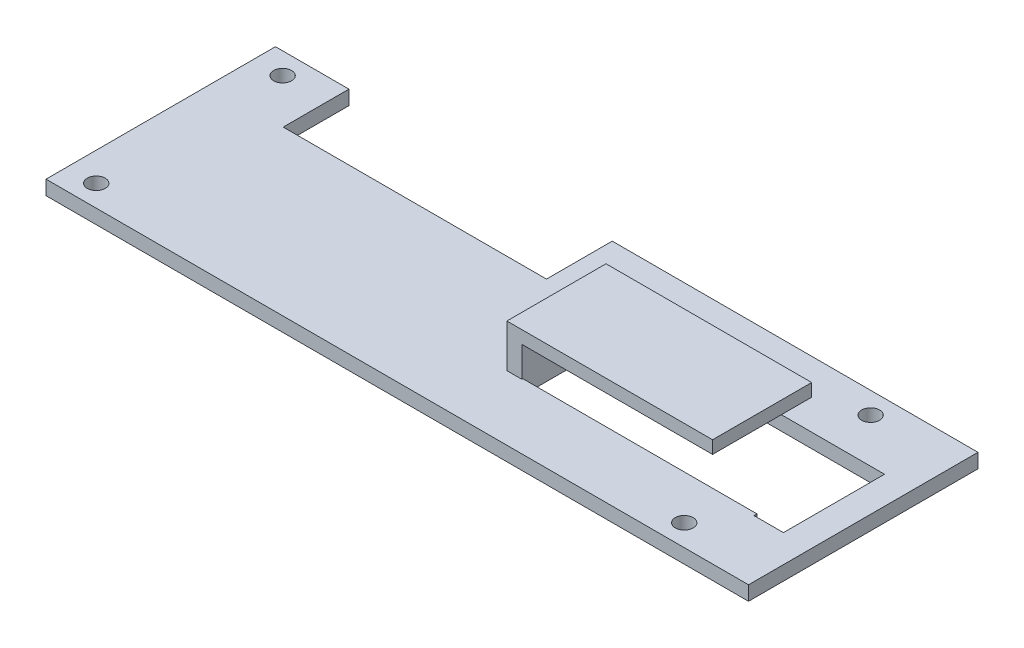
ISO-10303-21;
HEADER;
FILE_DESCRIPTION(('STEP AP214'),'2;1');
FILE_NAME('part.step','',(''),(''),'','','');
FILE_SCHEMA(('AUTOMOTIVE_DESIGN { 1 0 10303 214 1 1 1 1 }'));
ENDSEC;
DATA;
#1=APPLICATION_CONTEXT('core data for automotive mechanical design processes');
#2=APPLICATION_PROTOCOL_DEFINITION('international standard','automotive_design',2000,#1);
#3=PRODUCT_CONTEXT('',#1,'mechanical');
#4=PRODUCT('Part','Part','',(#3));
#5=PRODUCT_RELATED_PRODUCT_CATEGORY('part','',(#4));
#6=PRODUCT_DEFINITION_FORMATION('','',#4);
#7=PRODUCT_DEFINITION_CONTEXT('part definition',#1,'design');
#8=PRODUCT_DEFINITION('design','',#6,#7);
#9=PRODUCT_DEFINITION_SHAPE('','',#8);
#10=(LENGTH_UNIT() NAMED_UNIT(*) SI_UNIT(.MILLI.,.METRE.));
#11=(NAMED_UNIT(*) PLANE_ANGLE_UNIT() SI_UNIT($,.RADIAN.));
#12=(NAMED_UNIT(*) SI_UNIT($,.STERADIAN.) SOLID_ANGLE_UNIT());
#13=UNCERTAINTY_MEASURE_WITH_UNIT(LENGTH_MEASURE(1.E-05),#10,'distance_accuracy_value','');
#14=(GEOMETRIC_REPRESENTATION_CONTEXT(3) GLOBAL_UNCERTAINTY_ASSIGNED_CONTEXT((#13)) GLOBAL_UNIT_ASSIGNED_CONTEXT((#10,
#11,#12)) REPRESENTATION_CONTEXT('',''));
#15=CARTESIAN_POINT('',(0.,0.,0.));
#16=DIRECTION('',(0.,0.,1.));
#17=DIRECTION('',(1.,0.,0.));
#18=AXIS2_PLACEMENT_3D('',#15,#16,#17);
#19=CARTESIAN_POINT('',(15.6834448872923,0.,8.70004466167328));
#20=DIRECTION('',(-1.,0.,0.));
#21=DIRECTION('',(0.,0.,1.));
#22=AXIS2_PLACEMENT_3D('',#19,#20,#21);
#23=PLANE('',#22);
#24=DIRECTION('',(0.,0.,-1.));
#25=VECTOR('',#24,1.);
#26=CARTESIAN_POINT('',(15.6834448872923,7.90411967097881,8.87999145213382));
#27=LINE('',#26,#25);
#28=CARTESIAN_POINT('',(15.6834448872923,7.90411967097881,8.87999145213382));
#29=VERTEX_POINT('',#28);
#30=CARTESIAN_POINT('',(15.6834448872923,7.90411967097881,-8.67352585330855));
#31=VERTEX_POINT('',#30);
#32=EDGE_CURVE('E221',#29,#31,#27,.T.);
#33=ORIENTED_EDGE('',*,*,#32,.F.);
#34=DIRECTION('',(0.,-1.,0.));
#35=VECTOR('',#34,1.);
#36=CARTESIAN_POINT('',(15.6834448872923,10.16,8.87999145213382));
#37=LINE('',#36,#35);
#38=CARTESIAN_POINT('',(15.6834448872923,2.54,8.87999145213382));
#39=VERTEX_POINT('',#38);
#40=EDGE_CURVE('E68',#29,#39,#37,.T.);
#41=ORIENTED_EDGE('',*,*,#40,.T.);
#42=DIRECTION('',(0.,0.,-1.));
#43=VECTOR('',#42,1.);
#44=CARTESIAN_POINT('',(15.6834448872923,2.54,-8.67352585330855));
#45=LINE('',#44,#43);
#46=CARTESIAN_POINT('',(15.6834448872923,2.54,8.70004466167328));
#47=VERTEX_POINT('',#46);
#48=EDGE_CURVE('E245',#39,#47,#45,.T.);
#49=ORIENTED_EDGE('',*,*,#48,.T.);
#50=DIRECTION('',(0.,1.,0.));
#51=VECTOR('',#50,1.);
#52=CARTESIAN_POINT('',(15.6834448872923,0.,8.70004466167328));
#53=LINE('',#52,#51);
#54=CARTESIAN_POINT('',(15.6834448872923,0.,8.70004466167328));
#55=VERTEX_POINT('',#54);
#56=EDGE_CURVE('E278',#55,#47,#53,.T.);
#57=ORIENTED_EDGE('',*,*,#56,.F.);
#58=DIRECTION('',(0.,0.,1.));
#59=VECTOR('',#58,1.);
#60=CARTESIAN_POINT('',(15.6834448872923,0.,8.70004466167328));
#61=LINE('',#60,#59);
#62=CARTESIAN_POINT('',(15.6834448872923,0.,-8.67352585330855));
#63=VERTEX_POINT('',#62);
#64=EDGE_CURVE('E272',#63,#55,#61,.T.);
#65=ORIENTED_EDGE('',*,*,#64,.F.);
#66=DIRECTION('',(0.,1.,0.));
#67=VECTOR('',#66,1.);
#68=CARTESIAN_POINT('',(15.6834448872923,0.,-8.67352585330855));
#69=LINE('',#68,#67);
#70=CARTESIAN_POINT('',(15.6834448872923,2.54,-8.67352585330855));
#71=VERTEX_POINT('',#70);
#72=EDGE_CURVE('E187',#63,#71,#69,.T.);
#73=ORIENTED_EDGE('',*,*,#72,.T.);
#74=DIRECTION('',(0.,-1.,0.));
#75=VECTOR('',#74,1.);
#76=CARTESIAN_POINT('',(15.6834448872923,10.16,-8.67352585330855));
#77=LINE('',#76,#75);
#78=EDGE_CURVE('E269',#31,#71,#77,.T.);
#79=ORIENTED_EDGE('',*,*,#78,.F.);
#80=EDGE_LOOP('',(#33,#41,#49,#57,#65,#73,#79));
#81=FACE_BOUND('',#80,.T.);
#82=ADVANCED_FACE('F45',(#81),#23,.F.);
#83=CARTESIAN_POINT('',(0.,2.54,0.));
#84=DIRECTION('',(0.,-1.,0.));
#85=DIRECTION('',(0.,0.,-1.));
#86=AXIS2_PLACEMENT_3D('',#83,#84,#85);
#87=PLANE('',#86);
#88=DIRECTION('',(0.,0.,-1.));
#89=VECTOR('',#88,1.);
#90=CARTESIAN_POINT('',(67.2764948745745,2.54,20.32));
#91=LINE('',#90,#89);
#92=CARTESIAN_POINT('',(67.2764948745745,2.54,20.32));
#93=VERTEX_POINT('',#92);
#94=CARTESIAN_POINT('',(67.2764948745745,2.54,-20.32));
#95=VERTEX_POINT('',#94);
#96=EDGE_CURVE('E206',#93,#95,#91,.T.);
#97=ORIENTED_EDGE('',*,*,#96,.T.);
#98=DIRECTION('',(-1.,0.,0.));
#99=VECTOR('',#98,1.);
#100=CARTESIAN_POINT('',(-57.15,2.54,-20.32));
#101=LINE('',#100,#99);
#102=CARTESIAN_POINT('',(2.49577155822135,2.54,-20.32));
#103=VERTEX_POINT('',#102);
#104=EDGE_CURVE('E338',#95,#103,#101,.T.);
#105=ORIENTED_EDGE('',*,*,#104,.T.);
#106=DIRECTION('',(0.,0.,-1.));
#107=VECTOR('',#106,1.);
#108=CARTESIAN_POINT('',(2.49577155822135,2.54,-8.67352585330855));
#109=LINE('',#108,#107);
#110=CARTESIAN_POINT('',(2.49577155822135,2.54,-8.67352585330855));
#111=VERTEX_POINT('',#110);
#112=EDGE_CURVE('E292',#111,#103,#109,.T.);
#113=ORIENTED_EDGE('',*,*,#112,.F.);
#114=DIRECTION('',(1.,0.,0.));
#115=VECTOR('',#114,1.);
#116=CARTESIAN_POINT('',(-44.1328146347756,2.54,-8.67352585330855));
#117=LINE('',#116,#115);
#118=CARTESIAN_POINT('',(-44.1328146347756,2.54,-8.67352585330855));
#119=VERTEX_POINT('',#118);
#120=EDGE_CURVE('E294',#119,#111,#117,.T.);
#121=ORIENTED_EDGE('',*,*,#120,.F.);
#122=DIRECTION('',(0.,0.,1.));
#123=VECTOR('',#122,1.);
#124=CARTESIAN_POINT('',(-44.1328146347756,2.54,-8.67352585330855));
#125=LINE('',#124,#123);
#126=CARTESIAN_POINT('',(-44.1328146347756,2.54,-20.32));
#127=VERTEX_POINT('',#126);
#128=EDGE_CURVE('E282',#127,#119,#125,.T.);
#129=ORIENTED_EDGE('',*,*,#128,.F.);
#130=CARTESIAN_POINT('',(-57.15,2.54,-20.32));
#131=VERTEX_POINT('',#130);
#132=EDGE_CURVE('E336',#127,#131,#101,.T.);
#133=ORIENTED_EDGE('',*,*,#132,.T.);
#134=DIRECTION('',(0.,0.,1.));
#135=VECTOR('',#134,1.);
#136=CARTESIAN_POINT('',(-57.15,2.54,20.32));
#137=LINE('',#136,#135);
#138=CARTESIAN_POINT('',(-57.15,2.54,20.32));
#139=VERTEX_POINT('',#138);
#140=EDGE_CURVE('E341',#131,#139,#137,.T.);
#141=ORIENTED_EDGE('',*,*,#140,.T.);
#142=DIRECTION('',(1.,0.,0.));
#143=VECTOR('',#142,1.);
#144=CARTESIAN_POINT('',(-57.15,2.54,20.32));
#145=LINE('',#144,#143);
#146=EDGE_CURVE('E343',#139,#93,#145,.T.);
#147=ORIENTED_EDGE('',*,*,#146,.T.);
#148=EDGE_LOOP('',(#97,#105,#113,#121,#129,#133,#141,#147));
#149=FACE_BOUND('',#148,.T.);
#150=CARTESIAN_POINT('',(-52.07,2.54,-16.51));
#151=DIRECTION('',(0.,1.,0.));
#152=DIRECTION('',(0.,0.,1.));
#153=AXIS2_PLACEMENT_3D('',#150,#151,#152);
#154=CIRCLE('',#153,1.5875);
#155=CARTESIAN_POINT('',(-52.07,2.54,-14.9225));
#156=VERTEX_POINT('',#155);
#157=EDGE_CURVE('E314',#156,#156,#154,.T.);
#158=ORIENTED_EDGE('',*,*,#157,.F.);
#159=EDGE_LOOP('',(#158));
#160=FACE_BOUND('',#159,.T.);
#161=CARTESIAN_POINT('',(52.07,2.54,-16.51));
#162=DIRECTION('',(0.,1.,0.));
#163=DIRECTION('',(0.,0.,1.));
#164=AXIS2_PLACEMENT_3D('',#161,#162,#163);
#165=CIRCLE('',#164,1.5875);
#166=CARTESIAN_POINT('',(52.07,2.54,-14.9225));
#167=VERTEX_POINT('',#166);
#168=EDGE_CURVE('E311',#167,#167,#165,.T.);
#169=ORIENTED_EDGE('',*,*,#168,.F.);
#170=EDGE_LOOP('',(#169));
#171=FACE_BOUND('',#170,.T.);
#172=CARTESIAN_POINT('',(52.07,2.54,16.51));
#173=DIRECTION('',(0.,1.,0.));
#174=DIRECTION('',(0.,0.,1.));
#175=AXIS2_PLACEMENT_3D('',#172,#173,#174);
#176=CIRCLE('',#175,1.5875);
#177=CARTESIAN_POINT('',(52.07,2.54,18.0975));
#178=VERTEX_POINT('',#177);
#179=EDGE_CURVE('E318',#178,#178,#176,.T.);
#180=ORIENTED_EDGE('',*,*,#179,.F.);
#181=EDGE_LOOP('',(#180));
#182=FACE_BOUND('',#181,.T.);
#183=CARTESIAN_POINT('',(-52.07,2.54,16.51));
#184=DIRECTION('',(0.,1.,0.));
#185=DIRECTION('',(0.,0.,1.));
#186=AXIS2_PLACEMENT_3D('',#183,#184,#185);
#187=CIRCLE('',#186,1.5875);
#188=CARTESIAN_POINT('',(-52.07,2.54,18.0975));
#189=VERTEX_POINT('',#188);
#190=EDGE_CURVE('E324',#189,#189,#187,.T.);
#191=ORIENTED_EDGE('',*,*,#190,.F.);
#192=EDGE_LOOP('',(#191));
#193=FACE_BOUND('',#192,.T.);
#194=ORIENTED_EDGE('',*,*,#48,.F.);
#195=DIRECTION('',(1.,0.,0.));
#196=VECTOR('',#195,1.);
#197=CARTESIAN_POINT('',(15.6834448872923,2.54,8.87999145213382));
#198=LINE('',#197,#196);
#199=CARTESIAN_POINT('',(13.0396842858424,2.54,8.87999145213382));
#200=VERTEX_POINT('',#199);
#201=EDGE_CURVE('E249',#200,#39,#198,.T.);
#202=ORIENTED_EDGE('',*,*,#201,.F.);
#203=DIRECTION('',(0.,0.,1.));
#204=VECTOR('',#203,1.);
#205=CARTESIAN_POINT('',(13.0396842858424,2.54,-8.67352585330855));
#206=LINE('',#205,#204);
#207=CARTESIAN_POINT('',(13.0396842858424,2.54,-8.67352585330855));
#208=VERTEX_POINT('',#207);
#209=EDGE_CURVE('E257',#208,#200,#206,.T.);
#210=ORIENTED_EDGE('',*,*,#209,.F.);
#211=DIRECTION('',(-1.,0.,0.));
#212=VECTOR('',#211,1.);
#213=CARTESIAN_POINT('',(15.6834448872923,2.54,-8.67352585330855));
#214=LINE('',#213,#212);
#215=EDGE_CURVE('E254',#71,#208,#214,.T.);
#216=ORIENTED_EDGE('',*,*,#215,.F.);
#217=DIRECTION('',(-1.,0.,0.));
#218=VECTOR('',#217,1.);
#219=CARTESIAN_POINT('',(15.6834448872923,2.54,-8.67352585330855));
#220=LINE('',#219,#218);
#221=CARTESIAN_POINT('',(62.3660195602017,2.54,-8.67352585330855));
#222=VERTEX_POINT('',#221);
#223=EDGE_CURVE('E275',#222,#71,#220,.T.);
#224=ORIENTED_EDGE('',*,*,#223,.F.);
#225=DIRECTION('',(0.,0.,1.));
#226=VECTOR('',#225,1.);
#227=CARTESIAN_POINT('',(62.3660195602017,2.54,-8.67352585330855));
#228=LINE('',#227,#226);
#229=CARTESIAN_POINT('',(62.3660195602017,2.54,9.23065765432882));
#230=VERTEX_POINT('',#229);
#231=EDGE_CURVE('E197',#222,#230,#228,.T.);
#232=ORIENTED_EDGE('',*,*,#231,.T.);
#233=DIRECTION('',(-1.,0.,0.));
#234=VECTOR('',#233,1.);
#235=CARTESIAN_POINT('',(62.3660195602017,2.54,9.23065765432882));
#236=LINE('',#235,#234);
#237=CARTESIAN_POINT('',(57.15,2.54,9.23065765432881));
#238=VERTEX_POINT('',#237);
#239=EDGE_CURVE('E210',#230,#238,#236,.T.);
#240=ORIENTED_EDGE('',*,*,#239,.T.);
#241=DIRECTION('',(0.,0.,-1.));
#242=VECTOR('',#241,1.);
#243=CARTESIAN_POINT('',(57.15,2.54,20.32));
#244=LINE('',#243,#242);
#245=CARTESIAN_POINT('',(57.15,2.54,8.70004466167328));
#246=VERTEX_POINT('',#245);
#247=EDGE_CURVE('E60',#238,#246,#244,.T.);
#248=ORIENTED_EDGE('',*,*,#247,.T.);
#249=DIRECTION('',(1.,0.,0.));
#250=VECTOR('',#249,1.);
#251=CARTESIAN_POINT('',(15.6834448872923,2.54,8.70004466167328));
#252=LINE('',#251,#250);
#253=EDGE_CURVE('E279',#47,#246,#252,.T.);
#254=ORIENTED_EDGE('',*,*,#253,.F.);
#255=EDGE_LOOP('',(#194,#202,#210,#216,#224,#232,#240,#248,#254));
#256=FACE_BOUND('',#255,.T.);
#257=ADVANCED_FACE('F382',(#149,#160,#171,#182,#193,#256),#87,.F.);
#258=CARTESIAN_POINT('',(-57.15,2.54,-20.32));
#259=DIRECTION('',(0.,0.,1.));
#260=DIRECTION('',(1.,0.,0.));
#261=AXIS2_PLACEMENT_3D('',#258,#259,#260);
#262=PLANE('',#261);
#263=ORIENTED_EDGE('',*,*,#132,.F.);
#264=DIRECTION('',(0.,-1.,0.));
#265=VECTOR('',#264,1.);
#266=CARTESIAN_POINT('',(-44.1328146347756,2.54,-20.32));
#267=LINE('',#266,#265);
#268=CARTESIAN_POINT('',(-44.1328146347756,0.,-20.32));
#269=VERTEX_POINT('',#268);
#270=EDGE_CURVE('E305',#127,#269,#267,.T.);
#271=ORIENTED_EDGE('',*,*,#270,.T.);
#272=DIRECTION('',(-1.,0.,0.));
#273=VECTOR('',#272,1.);
#274=CARTESIAN_POINT('',(-57.15,0.,-20.32));
#275=LINE('',#274,#273);
#276=CARTESIAN_POINT('',(-57.15,0.,-20.32));
#277=VERTEX_POINT('',#276);
#278=EDGE_CURVE('E347',#269,#277,#275,.T.);
#279=ORIENTED_EDGE('',*,*,#278,.T.);
#280=DIRECTION('',(0.,-1.,0.));
#281=VECTOR('',#280,1.);
#282=CARTESIAN_POINT('',(-57.15,2.54,-20.32));
#283=LINE('',#282,#281);
#284=EDGE_CURVE('E356',#131,#277,#283,.T.);
#285=ORIENTED_EDGE('',*,*,#284,.F.);
#286=EDGE_LOOP('',(#263,#271,#279,#285));
#287=FACE_BOUND('',#286,.T.);
#288=ADVANCED_FACE('F366',(#287),#262,.F.);
#289=CARTESIAN_POINT('',(57.15,2.54,20.32));
#290=DIRECTION('',(-1.,0.,0.));
#291=DIRECTION('',(0.,0.,1.));
#292=AXIS2_PLACEMENT_3D('',#289,#290,#291);
#293=PLANE('',#292);
#294=ORIENTED_EDGE('',*,*,#247,.F.);
#295=DIRECTION('',(0.,1.,0.));
#296=VECTOR('',#295,1.);
#297=CARTESIAN_POINT('',(57.15,0.,9.23065765432881));
#298=LINE('',#297,#296);
#299=CARTESIAN_POINT('',(57.15,0.,9.23065765432881));
#300=VERTEX_POINT('',#299);
#301=EDGE_CURVE('E225',#300,#238,#298,.T.);
#302=ORIENTED_EDGE('',*,*,#301,.F.);
#303=DIRECTION('',(0.,0.,-1.));
#304=VECTOR('',#303,1.);
#305=CARTESIAN_POINT('',(57.15,0.,20.32));
#306=LINE('',#305,#304);
#307=CARTESIAN_POINT('',(57.15,0.,8.70004466167328));
#308=VERTEX_POINT('',#307);
#309=EDGE_CURVE('E332',#300,#308,#306,.T.);
#310=ORIENTED_EDGE('',*,*,#309,.T.);
#311=DIRECTION('',(0.,1.,0.));
#312=VECTOR('',#311,1.);
#313=CARTESIAN_POINT('',(57.15,2.54,8.70004466167328));
#314=LINE('',#313,#312);
#315=EDGE_CURVE('E308',#308,#246,#314,.T.);
#316=ORIENTED_EDGE('',*,*,#315,.T.);
#317=EDGE_LOOP('',(#294,#302,#310,#316));
#318=FACE_BOUND('',#317,.T.);
#319=ADVANCED_FACE('F47',(#318),#293,.F.);
#320=CARTESIAN_POINT('',(67.2764948745745,0.,-20.32));
#321=VERTEX_POINT('',#320);
#322=CARTESIAN_POINT('',(2.49577155822135,0.,-20.32));
#323=VERTEX_POINT('',#322);
#324=EDGE_CURVE('E348',#321,#323,#275,.T.);
#325=ORIENTED_EDGE('',*,*,#324,.T.);
#326=DIRECTION('',(0.,1.,0.));
#327=VECTOR('',#326,1.);
#328=CARTESIAN_POINT('',(2.49577155822135,2.54,-20.32));
#329=LINE('',#328,#327);
#330=EDGE_CURVE('E285',#323,#103,#329,.T.);
#331=ORIENTED_EDGE('',*,*,#330,.T.);
#332=ORIENTED_EDGE('',*,*,#104,.F.);
#333=DIRECTION('',(0.,1.,0.));
#334=VECTOR('',#333,1.);
#335=CARTESIAN_POINT('',(67.2764948745745,0.,-20.32));
#336=LINE('',#335,#334);
#337=EDGE_CURVE('E218',#321,#95,#336,.T.);
#338=ORIENTED_EDGE('',*,*,#337,.F.);
#339=EDGE_LOOP('',(#325,#331,#332,#338));
#340=FACE_BOUND('',#339,.T.);
#341=ADVANCED_FACE('F392',(#340),#262,.F.);
#342=CARTESIAN_POINT('',(-57.15,2.54,20.32));
#343=DIRECTION('',(1.,0.,0.));
#344=DIRECTION('',(0.,0.,-1.));
#345=AXIS2_PLACEMENT_3D('',#342,#343,#344);
#346=PLANE('',#345);
#347=DIRECTION('',(0.,0.,1.));
#348=VECTOR('',#347,1.);
#349=CARTESIAN_POINT('',(-57.15,0.,20.32));
#350=LINE('',#349,#348);
#351=CARTESIAN_POINT('',(-57.15,0.,20.32));
#352=VERTEX_POINT('',#351);
#353=EDGE_CURVE('E351',#277,#352,#350,.T.);
#354=ORIENTED_EDGE('',*,*,#353,.T.);
#355=DIRECTION('',(0.,-1.,0.));
#356=VECTOR('',#355,1.);
#357=CARTESIAN_POINT('',(-57.15,2.54,20.32));
#358=LINE('',#357,#356);
#359=EDGE_CURVE('E345',#139,#352,#358,.T.);
#360=ORIENTED_EDGE('',*,*,#359,.F.);
#361=ORIENTED_EDGE('',*,*,#140,.F.);
#362=ORIENTED_EDGE('',*,*,#284,.T.);
#363=EDGE_LOOP('',(#354,#360,#361,#362));
#364=FACE_BOUND('',#363,.T.);
#365=ADVANCED_FACE('F374',(#364),#346,.F.);
#366=CARTESIAN_POINT('',(-57.15,2.54,20.32));
#367=DIRECTION('',(0.,0.,-1.));
#368=DIRECTION('',(-1.,0.,0.));
#369=AXIS2_PLACEMENT_3D('',#366,#367,#368);
#370=PLANE('',#369);
#371=DIRECTION('',(1.,0.,0.));
#372=VECTOR('',#371,1.);
#373=CARTESIAN_POINT('',(-57.15,0.,20.32));
#374=LINE('',#373,#372);
#375=CARTESIAN_POINT('',(67.2764948745745,0.,20.32));
#376=VERTEX_POINT('',#375);
#377=EDGE_CURVE('E337',#352,#376,#374,.T.);
#378=ORIENTED_EDGE('',*,*,#377,.T.);
#379=DIRECTION('',(0.,1.,0.));
#380=VECTOR('',#379,1.);
#381=CARTESIAN_POINT('',(67.2764948745745,0.,20.32));
#382=LINE('',#381,#380);
#383=EDGE_CURVE('E222',#376,#93,#382,.T.);
#384=ORIENTED_EDGE('',*,*,#383,.T.);
#385=ORIENTED_EDGE('',*,*,#146,.F.);
#386=ORIENTED_EDGE('',*,*,#359,.T.);
#387=EDGE_LOOP('',(#378,#384,#385,#386));
#388=FACE_BOUND('',#387,.T.);
#389=ADVANCED_FACE('F378',(#388),#370,.F.);
#390=CARTESIAN_POINT('',(0.,0.,0.));
#391=DIRECTION('',(0.,-1.,0.));
#392=DIRECTION('',(0.,0.,-1.));
#393=AXIS2_PLACEMENT_3D('',#390,#391,#392);
#394=PLANE('',#393);
#395=ORIENTED_EDGE('',*,*,#309,.F.);
#396=DIRECTION('',(-1.,0.,0.));
#397=VECTOR('',#396,1.);
#398=CARTESIAN_POINT('',(62.3660195602017,0.,9.23065765432882));
#399=LINE('',#398,#397);
#400=CARTESIAN_POINT('',(62.3660195602017,0.,9.23065765432882));
#401=VERTEX_POINT('',#400);
#402=EDGE_CURVE('E205',#401,#300,#399,.T.);
#403=ORIENTED_EDGE('',*,*,#402,.F.);
#404=DIRECTION('',(0.,0.,1.));
#405=VECTOR('',#404,1.);
#406=CARTESIAN_POINT('',(62.3660195602017,0.,-8.67352585330855));
#407=LINE('',#406,#405);
#408=CARTESIAN_POINT('',(62.3660195602017,0.,-8.67352585330855));
#409=VERTEX_POINT('',#408);
#410=EDGE_CURVE('E195',#409,#401,#407,.T.);
#411=ORIENTED_EDGE('',*,*,#410,.F.);
#412=DIRECTION('',(1.,0.,0.));
#413=VECTOR('',#412,1.);
#414=CARTESIAN_POINT('',(0.,0.,-8.67352585330855));
#415=LINE('',#414,#413);
#416=EDGE_CURVE('E11',#63,#409,#415,.T.);
#417=ORIENTED_EDGE('',*,*,#416,.F.);
#418=ORIENTED_EDGE('',*,*,#64,.T.);
#419=DIRECTION('',(1.,0.,0.));
#420=VECTOR('',#419,1.);
#421=CARTESIAN_POINT('',(15.6834448872923,0.,8.70004466167328));
#422=LINE('',#421,#420);
#423=EDGE_CURVE('E274',#55,#308,#422,.T.);
#424=ORIENTED_EDGE('',*,*,#423,.T.);
#425=EDGE_LOOP('',(#395,#403,#411,#417,#418,#424));
#426=FACE_BOUND('',#425,.T.);
#427=DIRECTION('',(0.,0.,-1.));
#428=VECTOR('',#427,1.);
#429=CARTESIAN_POINT('',(67.2764948745745,0.,20.32));
#430=LINE('',#429,#428);
#431=EDGE_CURVE('E199',#376,#321,#430,.T.);
#432=ORIENTED_EDGE('',*,*,#431,.F.);
#433=ORIENTED_EDGE('',*,*,#377,.F.);
#434=ORIENTED_EDGE('',*,*,#353,.F.);
#435=ORIENTED_EDGE('',*,*,#278,.F.);
#436=DIRECTION('',(0.,0.,-1.));
#437=VECTOR('',#436,1.);
#438=CARTESIAN_POINT('',(-44.1328146347756,0.,0.));
#439=LINE('',#438,#437);
#440=CARTESIAN_POINT('',(-44.1328146347756,0.,-8.67352585330855));
#441=VERTEX_POINT('',#440);
#442=EDGE_CURVE('E53',#441,#269,#439,.T.);
#443=ORIENTED_EDGE('',*,*,#442,.F.);
#444=DIRECTION('',(1.,0.,0.));
#445=VECTOR('',#444,1.);
#446=CARTESIAN_POINT('',(-44.1328146347756,0.,-8.67352585330855));
#447=LINE('',#446,#445);
#448=CARTESIAN_POINT('',(2.49577155822135,0.,-8.67352585330855));
#449=VERTEX_POINT('',#448);
#450=EDGE_CURVE('E295',#441,#449,#447,.T.);
#451=ORIENTED_EDGE('',*,*,#450,.T.);
#452=DIRECTION('',(0.,0.,-1.));
#453=VECTOR('',#452,1.);
#454=CARTESIAN_POINT('',(2.49577155822135,0.,-8.67352585330855));
#455=LINE('',#454,#453);
#456=EDGE_CURVE('E290',#449,#323,#455,.T.);
#457=ORIENTED_EDGE('',*,*,#456,.T.);
#458=ORIENTED_EDGE('',*,*,#324,.F.);
#459=EDGE_LOOP('',(#432,#433,#434,#435,#443,#451,#457,#458));
#460=FACE_BOUND('',#459,.T.);
#461=CARTESIAN_POINT('',(-52.07,0.,16.51));
#462=DIRECTION('',(0.,1.,0.));
#463=DIRECTION('',(0.,0.,1.));
#464=AXIS2_PLACEMENT_3D('',#461,#462,#463);
#465=CIRCLE('',#464,1.5875);
#466=CARTESIAN_POINT('',(-52.07,0.,18.0975));
#467=VERTEX_POINT('',#466);
#468=EDGE_CURVE('E310',#467,#467,#465,.T.);
#469=ORIENTED_EDGE('',*,*,#468,.T.);
#470=EDGE_LOOP('',(#469));
#471=FACE_BOUND('',#470,.T.);
#472=CARTESIAN_POINT('',(52.07,0.,16.51));
#473=DIRECTION('',(0.,1.,0.));
#474=DIRECTION('',(0.,0.,1.));
#475=AXIS2_PLACEMENT_3D('',#472,#473,#474);
#476=CIRCLE('',#475,1.5875);
#477=CARTESIAN_POINT('',(52.07,0.,18.0975));
#478=VERTEX_POINT('',#477);
#479=EDGE_CURVE('E321',#478,#478,#476,.T.);
#480=ORIENTED_EDGE('',*,*,#479,.T.);
#481=EDGE_LOOP('',(#480));
#482=FACE_BOUND('',#481,.T.);
#483=CARTESIAN_POINT('',(52.07,0.,-16.51));
#484=DIRECTION('',(0.,1.,0.));
#485=DIRECTION('',(0.,0.,1.));
#486=AXIS2_PLACEMENT_3D('',#483,#484,#485);
#487=CIRCLE('',#486,1.5875);
#488=CARTESIAN_POINT('',(52.07,0.,-14.9225));
#489=VERTEX_POINT('',#488);
#490=EDGE_CURVE('E315',#489,#489,#487,.T.);
#491=ORIENTED_EDGE('',*,*,#490,.T.);
#492=EDGE_LOOP('',(#491));
#493=FACE_BOUND('',#492,.T.);
#494=CARTESIAN_POINT('',(-52.07,0.,-16.51));
#495=DIRECTION('',(0.,1.,0.));
#496=DIRECTION('',(0.,0.,1.));
#497=AXIS2_PLACEMENT_3D('',#494,#495,#496);
#498=CIRCLE('',#497,1.5875);
#499=CARTESIAN_POINT('',(-52.07,0.,-14.9225));
#500=VERTEX_POINT('',#499);
#501=EDGE_CURVE('E329',#500,#500,#498,.T.);
#502=ORIENTED_EDGE('',*,*,#501,.T.);
#503=EDGE_LOOP('',(#502));
#504=FACE_BOUND('',#503,.T.);
#505=ADVANCED_FACE('F202',(#426,#460,#471,#482,#493,#504),#394,.T.);
#506=CARTESIAN_POINT('',(-52.07,0.,-16.51));
#507=DIRECTION('',(0.,1.,0.));
#508=DIRECTION('',(0.,0.,1.));
#509=AXIS2_PLACEMENT_3D('',#506,#507,#508);
#510=CYLINDRICAL_SURFACE('',#509,1.5875);
#511=ORIENTED_EDGE('',*,*,#501,.F.);
#512=EDGE_LOOP('',(#511));
#513=FACE_BOUND('',#512,.T.);
#514=ORIENTED_EDGE('',*,*,#157,.T.);
#515=EDGE_LOOP('',(#514));
#516=FACE_BOUND('',#515,.T.);
#517=ADVANCED_FACE('F433',(#513,#516),#510,.F.);
#518=CARTESIAN_POINT('',(52.07,0.,-16.51));
#519=DIRECTION('',(0.,1.,0.));
#520=DIRECTION('',(0.,0.,1.));
#521=AXIS2_PLACEMENT_3D('',#518,#519,#520);
#522=CYLINDRICAL_SURFACE('',#521,1.5875);
#523=ORIENTED_EDGE('',*,*,#490,.F.);
#524=EDGE_LOOP('',(#523));
#525=FACE_BOUND('',#524,.T.);
#526=ORIENTED_EDGE('',*,*,#168,.T.);
#527=EDGE_LOOP('',(#526));
#528=FACE_BOUND('',#527,.T.);
#529=ADVANCED_FACE('F429',(#525,#528),#522,.F.);
#530=CARTESIAN_POINT('',(52.07,0.,16.51));
#531=DIRECTION('',(0.,1.,0.));
#532=DIRECTION('',(0.,0.,1.));
#533=AXIS2_PLACEMENT_3D('',#530,#531,#532);
#534=CYLINDRICAL_SURFACE('',#533,1.5875);
#535=ORIENTED_EDGE('',*,*,#479,.F.);
#536=EDGE_LOOP('',(#535));
#537=FACE_BOUND('',#536,.T.);
#538=ORIENTED_EDGE('',*,*,#179,.T.);
#539=EDGE_LOOP('',(#538));
#540=FACE_BOUND('',#539,.T.);
#541=ADVANCED_FACE('F432',(#537,#540),#534,.F.);
#542=CARTESIAN_POINT('',(-52.07,0.,16.51));
#543=DIRECTION('',(0.,1.,0.));
#544=DIRECTION('',(0.,0.,1.));
#545=AXIS2_PLACEMENT_3D('',#542,#543,#544);
#546=CYLINDRICAL_SURFACE('',#545,1.5875);
#547=ORIENTED_EDGE('',*,*,#468,.F.);
#548=EDGE_LOOP('',(#547));
#549=FACE_BOUND('',#548,.T.);
#550=ORIENTED_EDGE('',*,*,#190,.T.);
#551=EDGE_LOOP('',(#550));
#552=FACE_BOUND('',#551,.T.);
#553=ADVANCED_FACE('F424',(#549,#552),#546,.F.);
#554=CARTESIAN_POINT('',(-44.1328146347756,0.,-8.67352585330855));
#555=DIRECTION('',(-1.,0.,0.));
#556=DIRECTION('',(0.,0.,1.));
#557=AXIS2_PLACEMENT_3D('',#554,#555,#556);
#558=PLANE('',#557);
#559=ORIENTED_EDGE('',*,*,#128,.T.);
#560=DIRECTION('',(0.,1.,0.));
#561=VECTOR('',#560,1.);
#562=CARTESIAN_POINT('',(-44.1328146347756,0.,-8.67352585330855));
#563=LINE('',#562,#561);
#564=EDGE_CURVE('E287',#441,#119,#563,.T.);
#565=ORIENTED_EDGE('',*,*,#564,.F.);
#566=ORIENTED_EDGE('',*,*,#442,.T.);
#567=ORIENTED_EDGE('',*,*,#270,.F.);
#568=EDGE_LOOP('',(#559,#565,#566,#567));
#569=FACE_BOUND('',#568,.T.);
#570=ADVANCED_FACE('F360',(#569),#558,.F.);
#571=CARTESIAN_POINT('',(2.49577155822135,0.,-8.67352585330855));
#572=DIRECTION('',(1.,0.,0.));
#573=DIRECTION('',(0.,0.,-1.));
#574=AXIS2_PLACEMENT_3D('',#571,#572,#573);
#575=PLANE('',#574);
#576=ORIENTED_EDGE('',*,*,#456,.F.);
#577=DIRECTION('',(0.,1.,0.));
#578=VECTOR('',#577,1.);
#579=CARTESIAN_POINT('',(2.49577155822135,0.,-8.67352585330855));
#580=LINE('',#579,#578);
#581=EDGE_CURVE('E271',#449,#111,#580,.T.);
#582=ORIENTED_EDGE('',*,*,#581,.T.);
#583=ORIENTED_EDGE('',*,*,#112,.T.);
#584=ORIENTED_EDGE('',*,*,#330,.F.);
#585=EDGE_LOOP('',(#576,#582,#583,#584));
#586=FACE_BOUND('',#585,.T.);
#587=ADVANCED_FACE('F423',(#586),#575,.F.);
#588=CARTESIAN_POINT('',(-44.1328146347756,0.,-8.67352585330855));
#589=DIRECTION('',(0.,0.,1.));
#590=DIRECTION('',(1.,0.,0.));
#591=AXIS2_PLACEMENT_3D('',#588,#589,#590);
#592=PLANE('',#591);
#593=ORIENTED_EDGE('',*,*,#120,.T.);
#594=ORIENTED_EDGE('',*,*,#581,.F.);
#595=ORIENTED_EDGE('',*,*,#450,.F.);
#596=ORIENTED_EDGE('',*,*,#564,.T.);
#597=EDGE_LOOP('',(#593,#594,#595,#596));
#598=FACE_BOUND('',#597,.T.);
#599=ADVANCED_FACE('F387',(#598),#592,.F.);
#600=CARTESIAN_POINT('',(15.6834448872923,0.,-8.67352585330855));
#601=DIRECTION('',(0.,0.,-1.));
#602=DIRECTION('',(-1.,0.,0.));
#603=AXIS2_PLACEMENT_3D('',#600,#601,#602);
#604=PLANE('',#603);
#605=ORIENTED_EDGE('',*,*,#223,.T.);
#606=ORIENTED_EDGE('',*,*,#72,.F.);
#607=ORIENTED_EDGE('',*,*,#416,.T.);
#608=DIRECTION('',(0.,1.,0.));
#609=VECTOR('',#608,1.);
#610=CARTESIAN_POINT('',(62.3660195602017,0.,-8.67352585330855));
#611=LINE('',#610,#609);
#612=EDGE_CURVE('E184',#409,#222,#611,.T.);
#613=ORIENTED_EDGE('',*,*,#612,.T.);
#614=EDGE_LOOP('',(#605,#606,#607,#613));
#615=FACE_BOUND('',#614,.T.);
#616=ADVANCED_FACE('F183',(#615),#604,.F.);
#617=CARTESIAN_POINT('',(15.6834448872923,0.,8.70004466167328));
#618=DIRECTION('',(0.,0.,1.));
#619=DIRECTION('',(1.,0.,0.));
#620=AXIS2_PLACEMENT_3D('',#617,#618,#619);
#621=PLANE('',#620);
#622=ORIENTED_EDGE('',*,*,#423,.F.);
#623=ORIENTED_EDGE('',*,*,#56,.T.);
#624=ORIENTED_EDGE('',*,*,#253,.T.);
#625=ORIENTED_EDGE('',*,*,#315,.F.);
#626=EDGE_LOOP('',(#622,#623,#624,#625));
#627=FACE_BOUND('',#626,.T.);
#628=ADVANCED_FACE('F419',(#627),#621,.F.);
#629=CARTESIAN_POINT('',(15.6834448872923,10.16,-8.67352585330855));
#630=DIRECTION('',(0.,0.,1.));
#631=DIRECTION('',(1.,0.,0.));
#632=AXIS2_PLACEMENT_3D('',#629,#630,#631);
#633=PLANE('',#632);
#634=ORIENTED_EDGE('',*,*,#215,.T.);
#635=DIRECTION('',(0.,-1.,0.));
#636=VECTOR('',#635,1.);
#637=CARTESIAN_POINT('',(13.0396842858424,10.16,-8.67352585330855));
#638=LINE('',#637,#636);
#639=CARTESIAN_POINT('',(13.0396842858424,10.16,-8.67352585330855));
#640=VERTEX_POINT('',#639);
#641=EDGE_CURVE('E266',#640,#208,#638,.T.);
#642=ORIENTED_EDGE('',*,*,#641,.F.);
#643=DIRECTION('',(-1.,0.,0.));
#644=VECTOR('',#643,1.);
#645=CARTESIAN_POINT('',(15.6834448872923,10.16,-8.67352585330855));
#646=LINE('',#645,#644);
#647=CARTESIAN_POINT('',(49.4654448872923,10.16,-8.67352585330855));
#648=VERTEX_POINT('',#647);
#649=EDGE_CURVE('E246',#648,#640,#646,.T.);
#650=ORIENTED_EDGE('',*,*,#649,.F.);
#651=DIRECTION('',(0.,1.,0.));
#652=VECTOR('',#651,1.);
#653=CARTESIAN_POINT('',(49.4654448872923,10.16,-8.67352585330855));
#654=LINE('',#653,#652);
#655=CARTESIAN_POINT('',(49.4654448872923,7.90411967097881,-8.67352585330855));
#656=VERTEX_POINT('',#655);
#657=EDGE_CURVE('E233',#656,#648,#654,.T.);
#658=ORIENTED_EDGE('',*,*,#657,.F.);
#659=DIRECTION('',(-1.,0.,0.));
#660=VECTOR('',#659,1.);
#661=CARTESIAN_POINT('',(49.4654448872923,7.90411967097881,-8.67352585330855));
#662=LINE('',#661,#660);
#663=EDGE_CURVE('E239',#656,#31,#662,.T.);
#664=ORIENTED_EDGE('',*,*,#663,.T.);
#665=ORIENTED_EDGE('',*,*,#78,.T.);
#666=EDGE_LOOP('',(#634,#642,#650,#658,#664,#665));
#667=FACE_BOUND('',#666,.T.);
#668=ADVANCED_FACE('F480',(#667),#633,.F.);
#669=CARTESIAN_POINT('',(13.0396842858424,10.16,-8.67352585330855));
#670=DIRECTION('',(1.,0.,0.));
#671=DIRECTION('',(0.,0.,-1.));
#672=AXIS2_PLACEMENT_3D('',#669,#670,#671);
#673=PLANE('',#672);
#674=ORIENTED_EDGE('',*,*,#209,.T.);
#675=DIRECTION('',(0.,-1.,0.));
#676=VECTOR('',#675,1.);
#677=CARTESIAN_POINT('',(13.0396842858424,10.16,8.87999145213382));
#678=LINE('',#677,#676);
#679=CARTESIAN_POINT('',(13.0396842858424,10.16,8.87999145213382));
#680=VERTEX_POINT('',#679);
#681=EDGE_CURVE('E263',#680,#200,#678,.T.);
#682=ORIENTED_EDGE('',*,*,#681,.F.);
#683=DIRECTION('',(0.,0.,1.));
#684=VECTOR('',#683,1.);
#685=CARTESIAN_POINT('',(13.0396842858424,10.16,-8.67352585330855));
#686=LINE('',#685,#684);
#687=EDGE_CURVE('E248',#640,#680,#686,.T.);
#688=ORIENTED_EDGE('',*,*,#687,.F.);
#689=ORIENTED_EDGE('',*,*,#641,.T.);
#690=EDGE_LOOP('',(#674,#682,#688,#689));
#691=FACE_BOUND('',#690,.T.);
#692=ADVANCED_FACE('F486',(#691),#673,.F.);
#693=CARTESIAN_POINT('',(15.6834448872923,10.16,8.87999145213382));
#694=DIRECTION('',(0.,0.,-1.));
#695=DIRECTION('',(-1.,0.,0.));
#696=AXIS2_PLACEMENT_3D('',#693,#694,#695);
#697=PLANE('',#696);
#698=ORIENTED_EDGE('',*,*,#201,.T.);
#699=ORIENTED_EDGE('',*,*,#40,.F.);
#700=DIRECTION('',(-1.,0.,0.));
#701=VECTOR('',#700,1.);
#702=CARTESIAN_POINT('',(49.4654448872923,7.90411967097881,8.87999145213382));
#703=LINE('',#702,#701);
#704=CARTESIAN_POINT('',(49.4654448872923,7.90411967097881,8.87999145213382));
#705=VERTEX_POINT('',#704);
#706=EDGE_CURVE('E243',#705,#29,#703,.T.);
#707=ORIENTED_EDGE('',*,*,#706,.F.);
#708=DIRECTION('',(0.,-1.,0.));
#709=VECTOR('',#708,1.);
#710=CARTESIAN_POINT('',(49.4654448872923,10.16,8.87999145213382));
#711=LINE('',#710,#709);
#712=CARTESIAN_POINT('',(49.4654448872923,10.16,8.87999145213382));
#713=VERTEX_POINT('',#712);
#714=EDGE_CURVE('E228',#713,#705,#711,.T.);
#715=ORIENTED_EDGE('',*,*,#714,.F.);
#716=DIRECTION('',(1.,0.,0.));
#717=VECTOR('',#716,1.);
#718=CARTESIAN_POINT('',(15.6834448872923,10.16,8.87999145213382));
#719=LINE('',#718,#717);
#720=EDGE_CURVE('E251',#680,#713,#719,.T.);
#721=ORIENTED_EDGE('',*,*,#720,.F.);
#722=ORIENTED_EDGE('',*,*,#681,.T.);
#723=EDGE_LOOP('',(#698,#699,#707,#715,#721,#722));
#724=FACE_BOUND('',#723,.T.);
#725=ADVANCED_FACE('F489',(#724),#697,.F.);
#726=CARTESIAN_POINT('',(0.,10.16,0.));
#727=DIRECTION('',(0.,-1.,0.));
#728=DIRECTION('',(0.,0.,-1.));
#729=AXIS2_PLACEMENT_3D('',#726,#727,#728);
#730=PLANE('',#729);
#731=ORIENTED_EDGE('',*,*,#720,.T.);
#732=DIRECTION('',(0.,0.,1.));
#733=VECTOR('',#732,1.);
#734=CARTESIAN_POINT('',(49.4654448872923,10.16,8.87999145213382));
#735=LINE('',#734,#733);
#736=EDGE_CURVE('E236',#648,#713,#735,.T.);
#737=ORIENTED_EDGE('',*,*,#736,.F.);
#738=ORIENTED_EDGE('',*,*,#649,.T.);
#739=ORIENTED_EDGE('',*,*,#687,.T.);
#740=EDGE_LOOP('',(#731,#737,#738,#739));
#741=FACE_BOUND('',#740,.T.);
#742=ADVANCED_FACE('F508',(#741),#730,.F.);
#743=CARTESIAN_POINT('',(49.4654448872923,7.90411967097881,8.87999145213382));
#744=DIRECTION('',(0.,1.,0.));
#745=DIRECTION('',(0.,0.,1.));
#746=AXIS2_PLACEMENT_3D('',#743,#744,#745);
#747=PLANE('',#746);
#748=ORIENTED_EDGE('',*,*,#32,.T.);
#749=ORIENTED_EDGE('',*,*,#663,.F.);
#750=DIRECTION('',(0.,0.,-1.));
#751=VECTOR('',#750,1.);
#752=CARTESIAN_POINT('',(49.4654448872923,7.90411967097881,8.87999145213382));
#753=LINE('',#752,#751);
#754=EDGE_CURVE('E231',#705,#656,#753,.T.);
#755=ORIENTED_EDGE('',*,*,#754,.F.);
#756=ORIENTED_EDGE('',*,*,#706,.T.);
#757=EDGE_LOOP('',(#748,#749,#755,#756));
#758=FACE_BOUND('',#757,.T.);
#759=ADVANCED_FACE('F406',(#758),#747,.F.);
#760=CARTESIAN_POINT('',(49.4654448872923,0.,0.));
#761=DIRECTION('',(1.,0.,0.));
#762=DIRECTION('',(0.,0.,-1.));
#763=AXIS2_PLACEMENT_3D('',#760,#761,#762);
#764=PLANE('',#763);
#765=ORIENTED_EDGE('',*,*,#714,.T.);
#766=ORIENTED_EDGE('',*,*,#754,.T.);
#767=ORIENTED_EDGE('',*,*,#657,.T.);
#768=ORIENTED_EDGE('',*,*,#736,.T.);
#769=EDGE_LOOP('',(#765,#766,#767,#768));
#770=FACE_BOUND('',#769,.T.);
#771=ADVANCED_FACE('F397',(#770),#764,.T.);
#772=CARTESIAN_POINT('',(67.2764948745745,0.,20.32));
#773=DIRECTION('',(1.,0.,0.));
#774=DIRECTION('',(0.,0.,-1.));
#775=AXIS2_PLACEMENT_3D('',#772,#773,#774);
#776=PLANE('',#775);
#777=ORIENTED_EDGE('',*,*,#96,.F.);
#778=ORIENTED_EDGE('',*,*,#383,.F.);
#779=ORIENTED_EDGE('',*,*,#431,.T.);
#780=ORIENTED_EDGE('',*,*,#337,.T.);
#781=EDGE_LOOP('',(#777,#778,#779,#780));
#782=FACE_BOUND('',#781,.T.);
#783=ADVANCED_FACE('F394',(#782),#776,.T.);
#784=CARTESIAN_POINT('',(62.3660195602017,0.,9.23065765432882));
#785=DIRECTION('',(0.,0.,-1.));
#786=DIRECTION('',(-1.,0.,0.));
#787=AXIS2_PLACEMENT_3D('',#784,#785,#786);
#788=PLANE('',#787);
#789=ORIENTED_EDGE('',*,*,#239,.F.);
#790=DIRECTION('',(0.,1.,0.));
#791=VECTOR('',#790,1.);
#792=CARTESIAN_POINT('',(62.3660195602017,0.,9.23065765432882));
#793=LINE('',#792,#791);
#794=EDGE_CURVE('E198',#401,#230,#793,.T.);
#795=ORIENTED_EDGE('',*,*,#794,.F.);
#796=ORIENTED_EDGE('',*,*,#402,.T.);
#797=ORIENTED_EDGE('',*,*,#301,.T.);
#798=EDGE_LOOP('',(#789,#795,#796,#797));
#799=FACE_BOUND('',#798,.T.);
#800=ADVANCED_FACE('F396',(#799),#788,.T.);
#801=CARTESIAN_POINT('',(62.3660195602017,0.,-8.67352585330855));
#802=DIRECTION('',(-1.,0.,0.));
#803=DIRECTION('',(0.,0.,1.));
#804=AXIS2_PLACEMENT_3D('',#801,#802,#803);
#805=PLANE('',#804);
#806=ORIENTED_EDGE('',*,*,#231,.F.);
#807=ORIENTED_EDGE('',*,*,#612,.F.);
#808=ORIENTED_EDGE('',*,*,#410,.T.);
#809=ORIENTED_EDGE('',*,*,#794,.T.);
#810=EDGE_LOOP('',(#806,#807,#808,#809));
#811=FACE_BOUND('',#810,.T.);
#812=ADVANCED_FACE('F194',(#811),#805,.T.);
#813=CLOSED_SHELL('',(#82,#257,#288,#319,#341,#365,#389,#505,#517,#529,#541,#553,#570,#587,#599,
#616,#628,#668,#692,#725,#742,#759,#771,#783,#800,#812));
#814=MANIFOLD_SOLID_BREP('B2',#813);
#815=ADVANCED_BREP_SHAPE_REPRESENTATION('',(#18,#814),#14);
#816=SHAPE_DEFINITION_REPRESENTATION(#9,#815);
ENDSEC;
END-ISO-10303-21;
